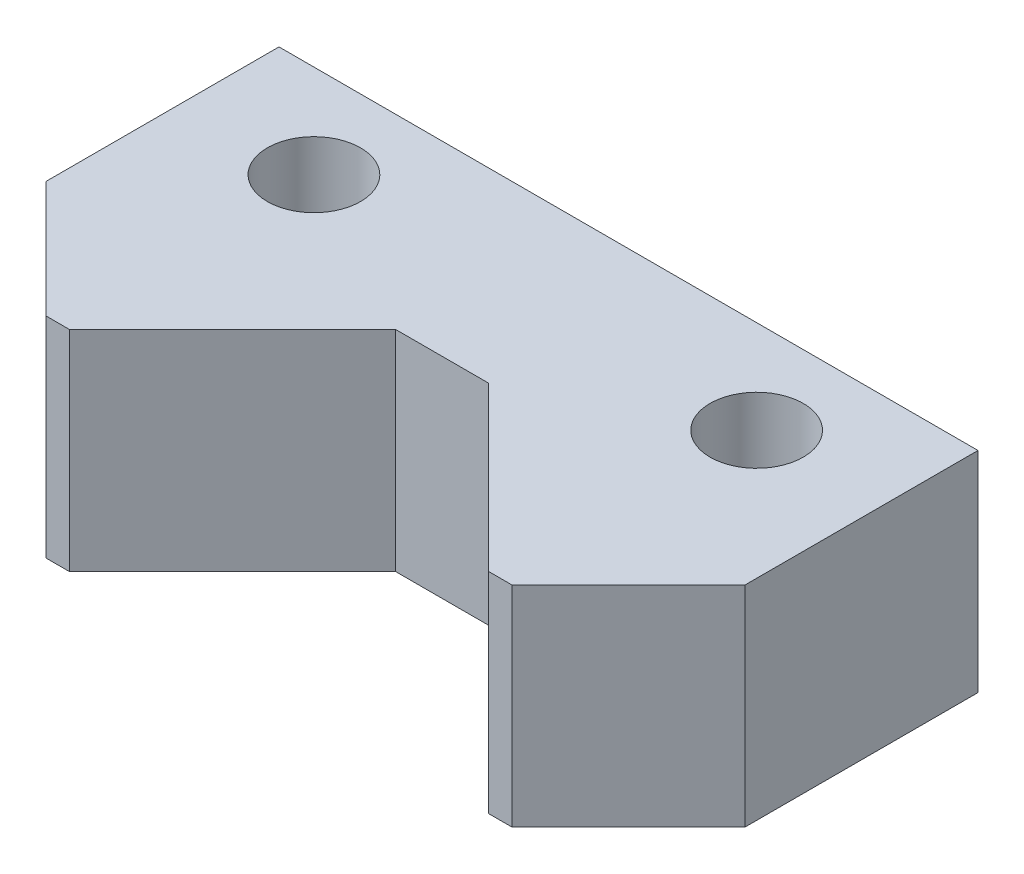
ISO-10303-21;
HEADER;
FILE_DESCRIPTION(('STEP AP214'),'2;1');
FILE_NAME('part.step','',(''),(''),'','','');
FILE_SCHEMA(('AUTOMOTIVE_DESIGN { 1 0 10303 214 1 1 1 1 }'));
ENDSEC;
DATA;
#1=APPLICATION_CONTEXT('core data for automotive mechanical design processes');
#2=APPLICATION_PROTOCOL_DEFINITION('international standard','automotive_design',2000,#1);
#3=PRODUCT_CONTEXT('',#1,'mechanical');
#4=PRODUCT('Part','Part','',(#3));
#5=PRODUCT_RELATED_PRODUCT_CATEGORY('part','',(#4));
#6=PRODUCT_DEFINITION_FORMATION('','',#4);
#7=PRODUCT_DEFINITION_CONTEXT('part definition',#1,'design');
#8=PRODUCT_DEFINITION('design','',#6,#7);
#9=PRODUCT_DEFINITION_SHAPE('','',#8);
#10=(LENGTH_UNIT() NAMED_UNIT(*) SI_UNIT(.MILLI.,.METRE.));
#11=(NAMED_UNIT(*) PLANE_ANGLE_UNIT() SI_UNIT($,.RADIAN.));
#12=(NAMED_UNIT(*) SI_UNIT($,.STERADIAN.) SOLID_ANGLE_UNIT());
#13=UNCERTAINTY_MEASURE_WITH_UNIT(LENGTH_MEASURE(1.E-05),#10,'distance_accuracy_value','');
#14=(GEOMETRIC_REPRESENTATION_CONTEXT(3) GLOBAL_UNCERTAINTY_ASSIGNED_CONTEXT((#13)) GLOBAL_UNIT_ASSIGNED_CONTEXT((#10,
#11,#12)) REPRESENTATION_CONTEXT('',''));
#15=CARTESIAN_POINT('',(0.,0.,0.));
#16=DIRECTION('',(0.,0.,1.));
#17=DIRECTION('',(1.,0.,0.));
#18=AXIS2_PLACEMENT_3D('',#15,#16,#17);
#19=CARTESIAN_POINT('',(-30.,9.,-16.));
#20=DIRECTION('',(1.,0.,0.));
#21=DIRECTION('',(0.,0.,-1.));
#22=AXIS2_PLACEMENT_3D('',#19,#20,#21);
#23=PLANE('',#22);
#24=DIRECTION('',(0.,0.,1.));
#25=VECTOR('',#24,1.);
#26=CARTESIAN_POINT('',(-30.,-9.,-16.));
#27=LINE('',#26,#25);
#28=CARTESIAN_POINT('',(-30.,-9.,-16.));
#29=VERTEX_POINT('',#28);
#30=CARTESIAN_POINT('',(-30.,-9.,4.00000000000012));
#31=VERTEX_POINT('',#30);
#32=EDGE_CURVE('E156',#29,#31,#27,.T.);
#33=ORIENTED_EDGE('',*,*,#32,.T.);
#34=DIRECTION('',(0.,-1.,0.));
#35=VECTOR('',#34,1.);
#36=CARTESIAN_POINT('',(-30.,9.,4.00000000000012));
#37=LINE('',#36,#35);
#38=CARTESIAN_POINT('',(-30.,9.,4.00000000000012));
#39=VERTEX_POINT('',#38);
#40=EDGE_CURVE('E11',#39,#31,#37,.T.);
#41=ORIENTED_EDGE('',*,*,#40,.F.);
#42=DIRECTION('',(0.,0.,1.));
#43=VECTOR('',#42,1.);
#44=CARTESIAN_POINT('',(-30.,9.,-16.));
#45=LINE('',#44,#43);
#46=CARTESIAN_POINT('',(-30.,9.,-16.));
#47=VERTEX_POINT('',#46);
#48=EDGE_CURVE('E185',#47,#39,#45,.T.);
#49=ORIENTED_EDGE('',*,*,#48,.F.);
#50=DIRECTION('',(0.,-1.,0.));
#51=VECTOR('',#50,1.);
#52=CARTESIAN_POINT('',(-30.,9.,-16.));
#53=LINE('',#52,#51);
#54=EDGE_CURVE('E152',#47,#29,#53,.T.);
#55=ORIENTED_EDGE('',*,*,#54,.T.);
#56=EDGE_LOOP('',(#33,#41,#49,#55));
#57=FACE_BOUND('',#56,.T.);
#58=ADVANCED_FACE('F43',(#57),#23,.F.);
#59=CARTESIAN_POINT('',(-30.,9.,4.00000000000012));
#60=DIRECTION('',(0.707106781186544,0.,-0.707106781186552));
#61=DIRECTION('',(-0.707106781186552,0.,-0.707106781186544));
#62=AXIS2_PLACEMENT_3D('',#59,#60,#61);
#63=PLANE('',#62);
#64=DIRECTION('',(0.707106781186551,0.,0.707106781186543));
#65=VECTOR('',#64,1.);
#66=CARTESIAN_POINT('',(-30.,-9.,4.00000000000012));
#67=LINE('',#66,#65);
#68=CARTESIAN_POINT('',(-20.,-9.,14.));
#69=VERTEX_POINT('',#68);
#70=EDGE_CURVE('E160',#31,#69,#67,.T.);
#71=ORIENTED_EDGE('',*,*,#70,.T.);
#72=DIRECTION('',(0.,-1.,0.));
#73=VECTOR('',#72,1.);
#74=CARTESIAN_POINT('',(-20.,9.,14.));
#75=LINE('',#74,#73);
#76=CARTESIAN_POINT('',(-20.,9.,14.));
#77=VERTEX_POINT('',#76);
#78=EDGE_CURVE('E52',#77,#69,#75,.T.);
#79=ORIENTED_EDGE('',*,*,#78,.F.);
#80=DIRECTION('',(0.707106781186551,0.,0.707106781186543));
#81=VECTOR('',#80,1.);
#82=CARTESIAN_POINT('',(-30.,9.,4.00000000000012));
#83=LINE('',#82,#81);
#84=EDGE_CURVE('E109',#39,#77,#83,.T.);
#85=ORIENTED_EDGE('',*,*,#84,.F.);
#86=ORIENTED_EDGE('',*,*,#40,.T.);
#87=EDGE_LOOP('',(#71,#79,#85,#86));
#88=FACE_BOUND('',#87,.T.);
#89=ADVANCED_FACE('F285',(#88),#63,.F.);
#90=CARTESIAN_POINT('',(-20.,9.,14.));
#91=DIRECTION('',(0.,0.,-1.));
#92=DIRECTION('',(-1.,0.,0.));
#93=AXIS2_PLACEMENT_3D('',#90,#91,#92);
#94=PLANE('',#93);
#95=DIRECTION('',(1.,0.,0.));
#96=VECTOR('',#95,1.);
#97=CARTESIAN_POINT('',(-20.,-9.,14.));
#98=LINE('',#97,#96);
#99=CARTESIAN_POINT('',(-18.,-9.,14.));
#100=VERTEX_POINT('',#99);
#101=EDGE_CURVE('E164',#69,#100,#98,.T.);
#102=ORIENTED_EDGE('',*,*,#101,.T.);
#103=DIRECTION('',(0.,-1.,0.));
#104=VECTOR('',#103,1.);
#105=CARTESIAN_POINT('',(-18.,9.,14.));
#106=LINE('',#105,#104);
#107=CARTESIAN_POINT('',(-18.,9.,14.));
#108=VERTEX_POINT('',#107);
#109=EDGE_CURVE('E204',#108,#100,#106,.T.);
#110=ORIENTED_EDGE('',*,*,#109,.F.);
#111=DIRECTION('',(1.,0.,0.));
#112=VECTOR('',#111,1.);
#113=CARTESIAN_POINT('',(-20.,9.,14.));
#114=LINE('',#113,#112);
#115=EDGE_CURVE('E214',#77,#108,#114,.T.);
#116=ORIENTED_EDGE('',*,*,#115,.F.);
#117=ORIENTED_EDGE('',*,*,#78,.T.);
#118=EDGE_LOOP('',(#102,#110,#116,#117));
#119=FACE_BOUND('',#118,.T.);
#120=ADVANCED_FACE('F212',(#119),#94,.F.);
#121=CARTESIAN_POINT('',(-18.,9.,14.));
#122=DIRECTION('',(-0.707106781186546,0.,-0.707106781186549));
#123=DIRECTION('',(-0.707106781186549,0.,0.707106781186546));
#124=AXIS2_PLACEMENT_3D('',#121,#122,#123);
#125=PLANE('',#124);
#126=DIRECTION('',(0.707106781186549,0.,-0.707106781186546));
#127=VECTOR('',#126,1.);
#128=CARTESIAN_POINT('',(-18.,-9.,14.));
#129=LINE('',#128,#127);
#130=CARTESIAN_POINT('',(-3.99999999999994,-9.,0.));
#131=VERTEX_POINT('',#130);
#132=EDGE_CURVE('E167',#100,#131,#129,.T.);
#133=ORIENTED_EDGE('',*,*,#132,.T.);
#134=DIRECTION('',(0.,-1.,0.));
#135=VECTOR('',#134,1.);
#136=CARTESIAN_POINT('',(-3.99999999999994,9.,0.));
#137=LINE('',#136,#135);
#138=CARTESIAN_POINT('',(-3.99999999999994,9.,0.));
#139=VERTEX_POINT('',#138);
#140=EDGE_CURVE('E200',#139,#131,#137,.T.);
#141=ORIENTED_EDGE('',*,*,#140,.F.);
#142=DIRECTION('',(0.707106781186549,0.,-0.707106781186546));
#143=VECTOR('',#142,1.);
#144=CARTESIAN_POINT('',(-18.,9.,14.));
#145=LINE('',#144,#143);
#146=EDGE_CURVE('E233',#108,#139,#145,.T.);
#147=ORIENTED_EDGE('',*,*,#146,.F.);
#148=ORIENTED_EDGE('',*,*,#109,.T.);
#149=EDGE_LOOP('',(#133,#141,#147,#148));
#150=FACE_BOUND('',#149,.T.);
#151=ADVANCED_FACE('F223',(#150),#125,.F.);
#152=CARTESIAN_POINT('',(-3.99999999999994,9.,0.));
#153=DIRECTION('',(0.,0.,-1.));
#154=DIRECTION('',(-1.,0.,0.));
#155=AXIS2_PLACEMENT_3D('',#152,#153,#154);
#156=PLANE('',#155);
#157=DIRECTION('',(1.,0.,0.));
#158=VECTOR('',#157,1.);
#159=CARTESIAN_POINT('',(-3.99999999999994,-9.,0.));
#160=LINE('',#159,#158);
#161=CARTESIAN_POINT('',(3.99999999999995,-9.,0.));
#162=VERTEX_POINT('',#161);
#163=EDGE_CURVE('E170',#131,#162,#160,.T.);
#164=ORIENTED_EDGE('',*,*,#163,.T.);
#165=DIRECTION('',(0.,-1.,0.));
#166=VECTOR('',#165,1.);
#167=CARTESIAN_POINT('',(3.99999999999995,9.,0.));
#168=LINE('',#167,#166);
#169=CARTESIAN_POINT('',(3.99999999999995,9.,0.));
#170=VERTEX_POINT('',#169);
#171=EDGE_CURVE('E196',#170,#162,#168,.T.);
#172=ORIENTED_EDGE('',*,*,#171,.F.);
#173=DIRECTION('',(1.,0.,0.));
#174=VECTOR('',#173,1.);
#175=CARTESIAN_POINT('',(-3.99999999999994,9.,0.));
#176=LINE('',#175,#174);
#177=EDGE_CURVE('E229',#139,#170,#176,.T.);
#178=ORIENTED_EDGE('',*,*,#177,.F.);
#179=ORIENTED_EDGE('',*,*,#140,.T.);
#180=EDGE_LOOP('',(#164,#172,#178,#179));
#181=FACE_BOUND('',#180,.T.);
#182=ADVANCED_FACE('F227',(#181),#156,.F.);
#183=CARTESIAN_POINT('',(18.,9.,14.));
#184=DIRECTION('',(0.707106781186546,0.,-0.707106781186549));
#185=DIRECTION('',(-0.707106781186549,0.,-0.707106781186546));
#186=AXIS2_PLACEMENT_3D('',#183,#184,#185);
#187=PLANE('',#186);
#188=DIRECTION('',(0.707106781186549,0.,0.707106781186546));
#189=VECTOR('',#188,1.);
#190=CARTESIAN_POINT('',(18.,-9.,14.));
#191=LINE('',#190,#189);
#192=CARTESIAN_POINT('',(18.,-9.,14.));
#193=VERTEX_POINT('',#192);
#194=EDGE_CURVE('E173',#162,#193,#191,.T.);
#195=ORIENTED_EDGE('',*,*,#194,.T.);
#196=DIRECTION('',(0.,-1.,0.));
#197=VECTOR('',#196,1.);
#198=CARTESIAN_POINT('',(18.,9.,14.));
#199=LINE('',#198,#197);
#200=CARTESIAN_POINT('',(18.,9.,14.));
#201=VERTEX_POINT('',#200);
#202=EDGE_CURVE('E192',#201,#193,#199,.T.);
#203=ORIENTED_EDGE('',*,*,#202,.F.);
#204=DIRECTION('',(0.707106781186549,0.,0.707106781186546));
#205=VECTOR('',#204,1.);
#206=CARTESIAN_POINT('',(18.,9.,14.));
#207=LINE('',#206,#205);
#208=EDGE_CURVE('E232',#170,#201,#207,.T.);
#209=ORIENTED_EDGE('',*,*,#208,.F.);
#210=ORIENTED_EDGE('',*,*,#171,.T.);
#211=EDGE_LOOP('',(#195,#203,#209,#210));
#212=FACE_BOUND('',#211,.T.);
#213=ADVANCED_FACE('F297',(#212),#187,.F.);
#214=CARTESIAN_POINT('',(20.,9.,14.));
#215=DIRECTION('',(0.,0.,-1.));
#216=DIRECTION('',(-1.,0.,0.));
#217=AXIS2_PLACEMENT_3D('',#214,#215,#216);
#218=PLANE('',#217);
#219=DIRECTION('',(1.,0.,0.));
#220=VECTOR('',#219,1.);
#221=CARTESIAN_POINT('',(20.,-9.,14.));
#222=LINE('',#221,#220);
#223=CARTESIAN_POINT('',(20.,-9.,14.));
#224=VERTEX_POINT('',#223);
#225=EDGE_CURVE('E176',#193,#224,#222,.T.);
#226=ORIENTED_EDGE('',*,*,#225,.T.);
#227=DIRECTION('',(0.,-1.,0.));
#228=VECTOR('',#227,1.);
#229=CARTESIAN_POINT('',(20.,9.,14.));
#230=LINE('',#229,#228);
#231=CARTESIAN_POINT('',(20.,9.,14.));
#232=VERTEX_POINT('',#231);
#233=EDGE_CURVE('E145',#232,#224,#230,.T.);
#234=ORIENTED_EDGE('',*,*,#233,.F.);
#235=DIRECTION('',(1.,0.,0.));
#236=VECTOR('',#235,1.);
#237=CARTESIAN_POINT('',(20.,9.,14.));
#238=LINE('',#237,#236);
#239=EDGE_CURVE('E134',#201,#232,#238,.T.);
#240=ORIENTED_EDGE('',*,*,#239,.F.);
#241=ORIENTED_EDGE('',*,*,#202,.T.);
#242=EDGE_LOOP('',(#226,#234,#240,#241));
#243=FACE_BOUND('',#242,.T.);
#244=ADVANCED_FACE('F294',(#243),#218,.F.);
#245=CARTESIAN_POINT('',(30.,9.,4.00000000000011));
#246=DIRECTION('',(-0.707106781186544,0.,-0.707106781186551));
#247=DIRECTION('',(-0.707106781186551,0.,0.707106781186544));
#248=AXIS2_PLACEMENT_3D('',#245,#246,#247);
#249=PLANE('',#248);
#250=DIRECTION('',(0.707106781186551,0.,-0.707106781186544));
#251=VECTOR('',#250,1.);
#252=CARTESIAN_POINT('',(30.,-9.,4.00000000000011));
#253=LINE('',#252,#251);
#254=CARTESIAN_POINT('',(30.,-9.,4.00000000000011));
#255=VERTEX_POINT('',#254);
#256=EDGE_CURVE('E143',#224,#255,#253,.T.);
#257=ORIENTED_EDGE('',*,*,#256,.T.);
#258=DIRECTION('',(0.,-1.,0.));
#259=VECTOR('',#258,1.);
#260=CARTESIAN_POINT('',(30.,9.,4.00000000000011));
#261=LINE('',#260,#259);
#262=CARTESIAN_POINT('',(30.,9.,4.00000000000011));
#263=VERTEX_POINT('',#262);
#264=EDGE_CURVE('E140',#263,#255,#261,.T.);
#265=ORIENTED_EDGE('',*,*,#264,.F.);
#266=DIRECTION('',(0.707106781186551,0.,-0.707106781186544));
#267=VECTOR('',#266,1.);
#268=CARTESIAN_POINT('',(30.,9.,4.00000000000011));
#269=LINE('',#268,#267);
#270=EDGE_CURVE('E128',#232,#263,#269,.T.);
#271=ORIENTED_EDGE('',*,*,#270,.F.);
#272=ORIENTED_EDGE('',*,*,#233,.T.);
#273=EDGE_LOOP('',(#257,#265,#271,#272));
#274=FACE_BOUND('',#273,.T.);
#275=ADVANCED_FACE('F141',(#274),#249,.F.);
#276=CARTESIAN_POINT('',(30.,9.,-16.));
#277=DIRECTION('',(-1.,0.,0.));
#278=DIRECTION('',(0.,0.,1.));
#279=AXIS2_PLACEMENT_3D('',#276,#277,#278);
#280=PLANE('',#279);
#281=DIRECTION('',(0.,0.,-1.));
#282=VECTOR('',#281,1.);
#283=CARTESIAN_POINT('',(30.,-9.,-16.));
#284=LINE('',#283,#282);
#285=CARTESIAN_POINT('',(30.,-9.,-16.));
#286=VERTEX_POINT('',#285);
#287=EDGE_CURVE('E95',#255,#286,#284,.T.);
#288=ORIENTED_EDGE('',*,*,#287,.T.);
#289=DIRECTION('',(0.,-1.,0.));
#290=VECTOR('',#289,1.);
#291=CARTESIAN_POINT('',(30.,9.,-16.));
#292=LINE('',#291,#290);
#293=CARTESIAN_POINT('',(30.,9.,-16.));
#294=VERTEX_POINT('',#293);
#295=EDGE_CURVE('E146',#294,#286,#292,.T.);
#296=ORIENTED_EDGE('',*,*,#295,.F.);
#297=DIRECTION('',(0.,0.,-1.));
#298=VECTOR('',#297,1.);
#299=CARTESIAN_POINT('',(30.,9.,-16.));
#300=LINE('',#299,#298);
#301=EDGE_CURVE('E132',#263,#294,#300,.T.);
#302=ORIENTED_EDGE('',*,*,#301,.F.);
#303=ORIENTED_EDGE('',*,*,#264,.T.);
#304=EDGE_LOOP('',(#288,#296,#302,#303));
#305=FACE_BOUND('',#304,.T.);
#306=ADVANCED_FACE('F148',(#305),#280,.F.);
#307=CARTESIAN_POINT('',(30.,9.,-16.));
#308=DIRECTION('',(0.,0.,1.));
#309=DIRECTION('',(1.,0.,0.));
#310=AXIS2_PLACEMENT_3D('',#307,#308,#309);
#311=PLANE('',#310);
#312=DIRECTION('',(-1.,0.,0.));
#313=VECTOR('',#312,1.);
#314=CARTESIAN_POINT('',(30.,-9.,-16.));
#315=LINE('',#314,#313);
#316=EDGE_CURVE('E101',#286,#29,#315,.T.);
#317=ORIENTED_EDGE('',*,*,#316,.T.);
#318=ORIENTED_EDGE('',*,*,#54,.F.);
#319=DIRECTION('',(-1.,0.,0.));
#320=VECTOR('',#319,1.);
#321=CARTESIAN_POINT('',(30.,9.,-16.));
#322=LINE('',#321,#320);
#323=EDGE_CURVE('E60',#294,#47,#322,.T.);
#324=ORIENTED_EDGE('',*,*,#323,.F.);
#325=ORIENTED_EDGE('',*,*,#295,.T.);
#326=EDGE_LOOP('',(#317,#318,#324,#325));
#327=FACE_BOUND('',#326,.T.);
#328=ADVANCED_FACE('F267',(#327),#311,.F.);
#329=CARTESIAN_POINT('',(0.,9.,0.));
#330=DIRECTION('',(0.,1.,0.));
#331=DIRECTION('',(0.,0.,1.));
#332=AXIS2_PLACEMENT_3D('',#329,#330,#331);
#333=PLANE('',#332);
#334=CARTESIAN_POINT('',(-19.,9.,-7.99999999999999));
#335=DIRECTION('',(0.,1.,0.));
#336=DIRECTION('',(0.,0.,1.));
#337=AXIS2_PLACEMENT_3D('',#334,#335,#336);
#338=CIRCLE('',#337,4.);
#339=CARTESIAN_POINT('',(-19.,9.,-3.99999999999999));
#340=VERTEX_POINT('',#339);
#341=EDGE_CURVE('E258',#340,#340,#338,.T.);
#342=ORIENTED_EDGE('',*,*,#341,.F.);
#343=EDGE_LOOP('',(#342));
#344=FACE_BOUND('',#343,.T.);
#345=CARTESIAN_POINT('',(19.,9.,-7.99999999999999));
#346=DIRECTION('',(0.,1.,0.));
#347=DIRECTION('',(0.,0.,1.));
#348=AXIS2_PLACEMENT_3D('',#345,#346,#347);
#349=CIRCLE('',#348,4.);
#350=CARTESIAN_POINT('',(19.,9.,-3.99999999999999));
#351=VERTEX_POINT('',#350);
#352=EDGE_CURVE('E250',#351,#351,#349,.T.);
#353=ORIENTED_EDGE('',*,*,#352,.F.);
#354=EDGE_LOOP('',(#353));
#355=FACE_BOUND('',#354,.T.);
#356=ORIENTED_EDGE('',*,*,#48,.T.);
#357=ORIENTED_EDGE('',*,*,#84,.T.);
#358=ORIENTED_EDGE('',*,*,#115,.T.);
#359=ORIENTED_EDGE('',*,*,#146,.T.);
#360=ORIENTED_EDGE('',*,*,#177,.T.);
#361=ORIENTED_EDGE('',*,*,#208,.T.);
#362=ORIENTED_EDGE('',*,*,#239,.T.);
#363=ORIENTED_EDGE('',*,*,#270,.T.);
#364=ORIENTED_EDGE('',*,*,#301,.T.);
#365=ORIENTED_EDGE('',*,*,#323,.T.);
#366=EDGE_LOOP('',(#356,#357,#358,#359,#360,#361,#362,#363,#364,#365));
#367=FACE_BOUND('',#366,.T.);
#368=ADVANCED_FACE('F130',(#344,#355,#367),#333,.T.);
#369=CARTESIAN_POINT('',(0.,-9.,0.));
#370=DIRECTION('',(0.,1.,0.));
#371=DIRECTION('',(0.,0.,1.));
#372=AXIS2_PLACEMENT_3D('',#369,#370,#371);
#373=PLANE('',#372);
#374=CARTESIAN_POINT('',(-19.,-9.,-7.99999999999999));
#375=DIRECTION('',(0.,1.,0.));
#376=DIRECTION('',(0.,0.,1.));
#377=AXIS2_PLACEMENT_3D('',#374,#375,#376);
#378=CIRCLE('',#377,4.);
#379=CARTESIAN_POINT('',(-19.,-9.,-3.99999999999999));
#380=VERTEX_POINT('',#379);
#381=EDGE_CURVE('E254',#380,#380,#378,.T.);
#382=ORIENTED_EDGE('',*,*,#381,.T.);
#383=EDGE_LOOP('',(#382));
#384=FACE_BOUND('',#383,.T.);
#385=CARTESIAN_POINT('',(19.,-9.,-7.99999999999999));
#386=DIRECTION('',(0.,1.,0.));
#387=DIRECTION('',(0.,0.,1.));
#388=AXIS2_PLACEMENT_3D('',#385,#386,#387);
#389=CIRCLE('',#388,4.);
#390=CARTESIAN_POINT('',(19.,-9.,-3.99999999999999));
#391=VERTEX_POINT('',#390);
#392=EDGE_CURVE('E161',#391,#391,#389,.T.);
#393=ORIENTED_EDGE('',*,*,#392,.T.);
#394=EDGE_LOOP('',(#393));
#395=FACE_BOUND('',#394,.T.);
#396=ORIENTED_EDGE('',*,*,#32,.F.);
#397=ORIENTED_EDGE('',*,*,#316,.F.);
#398=ORIENTED_EDGE('',*,*,#287,.F.);
#399=ORIENTED_EDGE('',*,*,#256,.F.);
#400=ORIENTED_EDGE('',*,*,#225,.F.);
#401=ORIENTED_EDGE('',*,*,#194,.F.);
#402=ORIENTED_EDGE('',*,*,#163,.F.);
#403=ORIENTED_EDGE('',*,*,#132,.F.);
#404=ORIENTED_EDGE('',*,*,#101,.F.);
#405=ORIENTED_EDGE('',*,*,#70,.F.);
#406=EDGE_LOOP('',(#396,#397,#398,#399,#400,#401,#402,#403,#404,#405));
#407=FACE_BOUND('',#406,.T.);
#408=ADVANCED_FACE('F218',(#384,#395,#407),#373,.F.);
#409=CARTESIAN_POINT('',(19.,9.,-7.99999999999999));
#410=DIRECTION('',(0.,1.,0.));
#411=DIRECTION('',(0.,0.,1.));
#412=AXIS2_PLACEMENT_3D('',#409,#410,#411);
#413=CYLINDRICAL_SURFACE('',#412,4.);
#414=ORIENTED_EDGE('',*,*,#392,.F.);
#415=EDGE_LOOP('',(#414));
#416=FACE_BOUND('',#415,.T.);
#417=ORIENTED_EDGE('',*,*,#352,.T.);
#418=EDGE_LOOP('',(#417));
#419=FACE_BOUND('',#418,.T.);
#420=ADVANCED_FACE('F271',(#416,#419),#413,.F.);
#421=CARTESIAN_POINT('',(-19.,9.,-7.99999999999999));
#422=DIRECTION('',(0.,1.,0.));
#423=DIRECTION('',(0.,0.,1.));
#424=AXIS2_PLACEMENT_3D('',#421,#422,#423);
#425=CYLINDRICAL_SURFACE('',#424,4.);
#426=ORIENTED_EDGE('',*,*,#381,.F.);
#427=EDGE_LOOP('',(#426));
#428=FACE_BOUND('',#427,.T.);
#429=ORIENTED_EDGE('',*,*,#341,.T.);
#430=EDGE_LOOP('',(#429));
#431=FACE_BOUND('',#430,.T.);
#432=ADVANCED_FACE('F263',(#428,#431),#425,.F.);
#433=CLOSED_SHELL('',(#58,#89,#120,#151,#182,#213,#244,#275,#306,#328,#368,#408,#420,#432));
#434=MANIFOLD_SOLID_BREP('B2',#433);
#435=ADVANCED_BREP_SHAPE_REPRESENTATION('',(#18,#434),#14);
#436=SHAPE_DEFINITION_REPRESENTATION(#9,#435);
ENDSEC;
END-ISO-10303-21;
